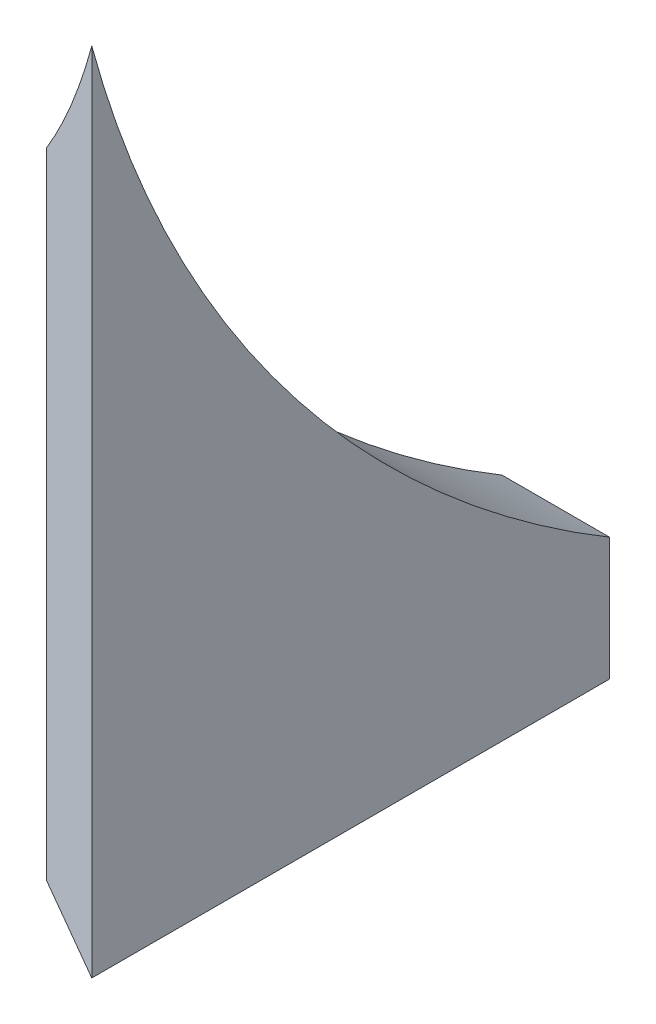
ISO-10303-21;
HEADER;
FILE_DESCRIPTION(('STEP AP214'),'2;1');
FILE_NAME('part.step','',(''),(''),'','','');
FILE_SCHEMA(('AUTOMOTIVE_DESIGN { 1 0 10303 214 1 1 1 1 }'));
ENDSEC;
DATA;
#1=APPLICATION_CONTEXT('core data for automotive mechanical design processes');
#2=APPLICATION_PROTOCOL_DEFINITION('international standard','automotive_design',2000,#1);
#3=PRODUCT_CONTEXT('',#1,'mechanical');
#4=PRODUCT('Part','Part','',(#3));
#5=PRODUCT_RELATED_PRODUCT_CATEGORY('part','',(#4));
#6=PRODUCT_DEFINITION_FORMATION('','',#4);
#7=PRODUCT_DEFINITION_CONTEXT('part definition',#1,'design');
#8=PRODUCT_DEFINITION('design','',#6,#7);
#9=PRODUCT_DEFINITION_SHAPE('','',#8);
#10=(LENGTH_UNIT() NAMED_UNIT(*) SI_UNIT(.MILLI.,.METRE.));
#11=(NAMED_UNIT(*) PLANE_ANGLE_UNIT() SI_UNIT($,.RADIAN.));
#12=(NAMED_UNIT(*) SI_UNIT($,.STERADIAN.) SOLID_ANGLE_UNIT());
#13=UNCERTAINTY_MEASURE_WITH_UNIT(LENGTH_MEASURE(1.E-05),#10,'distance_accuracy_value','');
#14=(GEOMETRIC_REPRESENTATION_CONTEXT(3) GLOBAL_UNCERTAINTY_ASSIGNED_CONTEXT((#13)) GLOBAL_UNIT_ASSIGNED_CONTEXT((#10,
#11,#12)) REPRESENTATION_CONTEXT('',''));
#15=CARTESIAN_POINT('',(0.,0.,0.));
#16=DIRECTION('',(0.,0.,1.));
#17=DIRECTION('',(1.,0.,0.));
#18=AXIS2_PLACEMENT_3D('',#15,#16,#17);
#19=CARTESIAN_POINT('',(4.,33.4342691998875,-29.2351488879258));
#20=DIRECTION('',(-1.,0.,0.));
#21=DIRECTION('',(0.,0.,1.));
#22=AXIS2_PLACEMENT_3D('',#19,#20,#21);
#23=CYLINDRICAL_SURFACE('',#22,42.5753320593088);
#24=CARTESIAN_POINT('',(0.,33.4342691998875,-29.2351488879258));
#25=DIRECTION('',(-1.,0.,0.));
#26=DIRECTION('',(0.,0.,-1.));
#27=AXIS2_PLACEMENT_3D('',#24,#25,#26);
#28=CIRCLE('',#27,42.5753320593088);
#29=CARTESIAN_POINT('',(0.,-3.10524913020123,-7.38286067443378));
#30=VERTEX_POINT('',#29);
#31=CARTESIAN_POINT('',(0.,15.8908713660281,9.55773824880774));
#32=VERTEX_POINT('',#31);
#33=EDGE_CURVE('E85',#30,#32,#28,.T.);
#34=ORIENTED_EDGE('',*,*,#33,.T.);
#35=CARTESIAN_POINT('',(-67.1912514931085,33.4342691998875,-29.2351488879258));
#36=DIRECTION('',(0.499999999999995,0.,-0.866025403784441));
#37=DIRECTION('',(-0.866025403784441,0.,-0.499999999999995));
#38=AXIS2_PLACEMENT_3D('',#35,#36,#37);
#39=ELLIPSE('',#38,85.1506641186184,42.5753320593088);
#40=CARTESIAN_POINT('',(4.,22.3319809863954,11.8671393255662));
#41=VERTEX_POINT('',#40);
#42=EDGE_CURVE('E47',#32,#41,#39,.F.);
#43=ORIENTED_EDGE('',*,*,#42,.T.);
#44=CARTESIAN_POINT('',(4.,33.4342691998875,-29.2351488879258));
#45=DIRECTION('',(-1.,0.,0.));
#46=DIRECTION('',(0.,0.,-1.));
#47=AXIS2_PLACEMENT_3D('',#44,#45,#46);
#48=CIRCLE('',#47,42.5753320593088);
#49=CARTESIAN_POINT('',(4.,-3.10524913020123,-7.38286067443378));
#50=VERTEX_POINT('',#49);
#51=EDGE_CURVE('E84',#50,#41,#48,.T.);
#52=ORIENTED_EDGE('',*,*,#51,.F.);
#53=DIRECTION('',(-1.,0.,0.));
#54=VECTOR('',#53,1.);
#55=CARTESIAN_POINT('',(4.,-3.10524913020123,-7.38286067443378));
#56=LINE('',#55,#54);
#57=EDGE_CURVE('E90',#50,#30,#56,.T.);
#58=ORIENTED_EDGE('',*,*,#57,.T.);
#59=EDGE_LOOP('',(#34,#43,#52,#58));
#60=FACE_BOUND('',#59,.T.);
#61=ADVANCED_FACE('F33',(#60),#23,.F.);
#62=CARTESIAN_POINT('',(4.,-7.66801901360456,11.8671393255662));
#63=DIRECTION('',(0.,1.,0.));
#64=DIRECTION('',(0.,0.,1.));
#65=AXIS2_PLACEMENT_3D('',#62,#63,#64);
#66=PLANE('',#65);
#67=DIRECTION('',(0.,0.,-1.));
#68=VECTOR('',#67,1.);
#69=CARTESIAN_POINT('',(4.,-7.66801901360456,11.8671393255662));
#70=LINE('',#69,#68);
#71=CARTESIAN_POINT('',(4.,-7.66801901360456,11.8671393255662));
#72=VERTEX_POINT('',#71);
#73=CARTESIAN_POINT('',(4.,-7.66801901360457,-7.38286067443378));
#74=VERTEX_POINT('',#73);
#75=EDGE_CURVE('E80',#72,#74,#70,.T.);
#76=ORIENTED_EDGE('',*,*,#75,.F.);
#77=DIRECTION('',(0.866025403784441,0.,0.499999999999995));
#78=VECTOR('',#77,1.);
#79=CARTESIAN_POINT('',(0.,-7.66801901360456,9.55773824880774));
#80=LINE('',#79,#78);
#81=CARTESIAN_POINT('',(0.,-7.66801901360456,9.55773824880774));
#82=VERTEX_POINT('',#81);
#83=EDGE_CURVE('E72',#82,#72,#80,.T.);
#84=ORIENTED_EDGE('',*,*,#83,.F.);
#85=DIRECTION('',(0.,0.,-1.));
#86=VECTOR('',#85,1.);
#87=CARTESIAN_POINT('',(0.,-7.66801901360456,11.8671393255662));
#88=LINE('',#87,#86);
#89=CARTESIAN_POINT('',(0.,-7.66801901360456,-7.38286067443378));
#90=VERTEX_POINT('',#89);
#91=EDGE_CURVE('E54',#82,#90,#88,.T.);
#92=ORIENTED_EDGE('',*,*,#91,.T.);
#93=DIRECTION('',(1.,0.,0.));
#94=VECTOR('',#93,1.);
#95=CARTESIAN_POINT('',(0.,-7.66801901360457,-7.38286067443378));
#96=LINE('',#95,#94);
#97=EDGE_CURVE('E99',#90,#74,#96,.T.);
#98=ORIENTED_EDGE('',*,*,#97,.T.);
#99=EDGE_LOOP('',(#76,#84,#92,#98));
#100=FACE_BOUND('',#99,.T.);
#101=ADVANCED_FACE('F78',(#100),#66,.F.);
#102=CARTESIAN_POINT('',(4.,33.4342691998875,-29.2351488879258));
#103=DIRECTION('',(1.,0.,0.));
#104=DIRECTION('',(0.,0.,-1.));
#105=AXIS2_PLACEMENT_3D('',#102,#103,#104);
#106=PLANE('',#105);
#107=DIRECTION('',(0.,-1.,0.));
#108=VECTOR('',#107,1.);
#109=CARTESIAN_POINT('',(4.,-7.66801901360457,-7.38286067443378));
#110=LINE('',#109,#108);
#111=EDGE_CURVE('E101',#50,#74,#110,.T.);
#112=ORIENTED_EDGE('',*,*,#111,.F.);
#113=ORIENTED_EDGE('',*,*,#51,.T.);
#114=DIRECTION('',(0.,-1.,0.));
#115=VECTOR('',#114,1.);
#116=CARTESIAN_POINT('',(4.,22.3319809863954,11.8671393255662));
#117=LINE('',#116,#115);
#118=EDGE_CURVE('E88',#41,#72,#117,.T.);
#119=ORIENTED_EDGE('',*,*,#118,.T.);
#120=ORIENTED_EDGE('',*,*,#75,.T.);
#121=EDGE_LOOP('',(#112,#113,#119,#120));
#122=FACE_BOUND('',#121,.T.);
#123=ADVANCED_FACE('F105',(#122),#106,.T.);
#124=CARTESIAN_POINT('',(0.,33.4342691998875,-29.2351488879258));
#125=DIRECTION('',(1.,0.,0.));
#126=DIRECTION('',(0.,0.,-1.));
#127=AXIS2_PLACEMENT_3D('',#124,#125,#126);
#128=PLANE('',#127);
#129=ORIENTED_EDGE('',*,*,#91,.F.);
#130=DIRECTION('',(0.,1.,0.));
#131=VECTOR('',#130,1.);
#132=CARTESIAN_POINT('',(0.,33.4342691998875,9.55773824880774));
#133=LINE('',#132,#131);
#134=EDGE_CURVE('E11',#82,#32,#133,.T.);
#135=ORIENTED_EDGE('',*,*,#134,.T.);
#136=ORIENTED_EDGE('',*,*,#33,.F.);
#137=DIRECTION('',(0.,-1.,0.));
#138=VECTOR('',#137,1.);
#139=CARTESIAN_POINT('',(0.,33.4342691998875,-7.38286067443378));
#140=LINE('',#139,#138);
#141=EDGE_CURVE('E40',#30,#90,#140,.T.);
#142=ORIENTED_EDGE('',*,*,#141,.T.);
#143=EDGE_LOOP('',(#129,#135,#136,#142));
#144=FACE_BOUND('',#143,.T.);
#145=ADVANCED_FACE('F83',(#144),#128,.F.);
#146=CARTESIAN_POINT('',(0.,-7.66801901360457,-7.38286067443378));
#147=DIRECTION('',(0.,0.,1.));
#148=DIRECTION('',(1.,0.,0.));
#149=AXIS2_PLACEMENT_3D('',#146,#147,#148);
#150=PLANE('',#149);
#151=ORIENTED_EDGE('',*,*,#111,.T.);
#152=ORIENTED_EDGE('',*,*,#97,.F.);
#153=ORIENTED_EDGE('',*,*,#141,.F.);
#154=ORIENTED_EDGE('',*,*,#57,.F.);
#155=EDGE_LOOP('',(#151,#152,#153,#154));
#156=FACE_BOUND('',#155,.T.);
#157=ADVANCED_FACE('F107',(#156),#150,.F.);
#158=CARTESIAN_POINT('',(0.,43.1319809863954,9.55773824880774));
#159=DIRECTION('',(0.499999999999995,0.,-0.866025403784441));
#160=DIRECTION('',(-0.866025403784441,0.,-0.499999999999995));
#161=AXIS2_PLACEMENT_3D('',#158,#159,#160);
#162=PLANE('',#161);
#163=ORIENTED_EDGE('',*,*,#134,.F.);
#164=ORIENTED_EDGE('',*,*,#83,.T.);
#165=ORIENTED_EDGE('',*,*,#118,.F.);
#166=ORIENTED_EDGE('',*,*,#42,.F.);
#167=EDGE_LOOP('',(#163,#164,#165,#166));
#168=FACE_BOUND('',#167,.T.);
#169=ADVANCED_FACE('F71',(#168),#162,.F.);
#170=CLOSED_SHELL('',(#61,#101,#123,#145,#157,#169));
#171=MANIFOLD_SOLID_BREP('B2',#170);
#172=ADVANCED_BREP_SHAPE_REPRESENTATION('',(#18,#171),#14);
#173=SHAPE_DEFINITION_REPRESENTATION(#9,#172);
ENDSEC;
END-ISO-10303-21;
